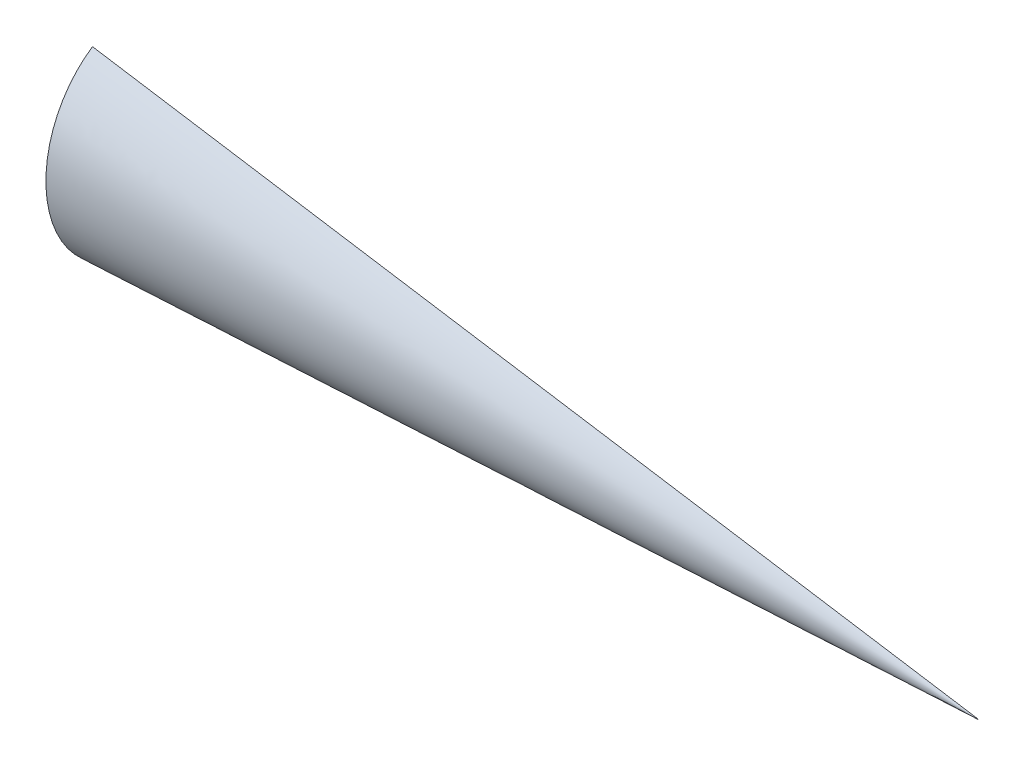
ISO-10303-21;
HEADER;
FILE_DESCRIPTION(('STEP AP214'),'2;1');
FILE_NAME('part.step','',(''),(''),'','','');
FILE_SCHEMA(('AUTOMOTIVE_DESIGN { 1 0 10303 214 1 1 1 1 }'));
ENDSEC;
DATA;
#1=APPLICATION_CONTEXT('core data for automotive mechanical design processes');
#2=APPLICATION_PROTOCOL_DEFINITION('international standard','automotive_design',2000,#1);
#3=PRODUCT_CONTEXT('',#1,'mechanical');
#4=PRODUCT('Part','Part','',(#3));
#5=PRODUCT_RELATED_PRODUCT_CATEGORY('part','',(#4));
#6=PRODUCT_DEFINITION_FORMATION('','',#4);
#7=PRODUCT_DEFINITION_CONTEXT('part definition',#1,'design');
#8=PRODUCT_DEFINITION('design','',#6,#7);
#9=PRODUCT_DEFINITION_SHAPE('','',#8);
#10=(LENGTH_UNIT() NAMED_UNIT(*) SI_UNIT(.MILLI.,.METRE.));
#11=(NAMED_UNIT(*) PLANE_ANGLE_UNIT() SI_UNIT($,.RADIAN.));
#12=(NAMED_UNIT(*) SI_UNIT($,.STERADIAN.) SOLID_ANGLE_UNIT());
#13=UNCERTAINTY_MEASURE_WITH_UNIT(LENGTH_MEASURE(1.E-05),#10,'distance_accuracy_value','');
#14=(GEOMETRIC_REPRESENTATION_CONTEXT(3) GLOBAL_UNCERTAINTY_ASSIGNED_CONTEXT((#13)) GLOBAL_UNIT_ASSIGNED_CONTEXT((#10,
#11,#12)) REPRESENTATION_CONTEXT('',''));
#15=CARTESIAN_POINT('',(0.,0.,0.));
#16=DIRECTION('',(0.,0.,1.));
#17=DIRECTION('',(1.,0.,0.));
#18=AXIS2_PLACEMENT_3D('',#15,#16,#17);
#19=CARTESIAN_POINT('',(0.,0.,0.));
#20=DIRECTION('',(1.,0.,0.));
#21=DIRECTION('',(0.,0.,-1.));
#22=AXIS2_PLACEMENT_3D('',#19,#20,#21);
#23=PLANE('',#22);
#24=CARTESIAN_POINT('',(0.,0.,0.));
#25=DIRECTION('',(1.,0.,0.));
#26=DIRECTION('',(0.,1.,0.));
#27=AXIS2_PLACEMENT_3D('',#24,#25,#26);
#28=ELLIPSE('',#27,0.2,0.1);
#29=CARTESIAN_POINT('',(0.,-0.199126845211858,-0.00933407086930567));
#30=VERTEX_POINT('',#29);
#31=CARTESIAN_POINT('',(0.,0.199126845211858,-0.00933407086930592));
#32=VERTEX_POINT('',#31);
#33=EDGE_CURVE('E11',#30,#32,#28,.T.);
#34=ORIENTED_EDGE('',*,*,#33,.T.);
#35=EDGE_CURVE('E52',#32,#30,#28,.T.);
#36=ORIENTED_EDGE('',*,*,#35,.T.);
#37=EDGE_LOOP('',(#34,#36));
#38=FACE_BOUND('',#37,.T.);
#39=ADVANCED_FACE('F45',(#38),#23,.T.);
#40=CARTESIAN_POINT('',(-1000.,0.,0.));
#41=DIRECTION('',(1.,0.,0.));
#42=DIRECTION('',(0.,0.,-1.));
#43=AXIS2_PLACEMENT_3D('',#40,#41,#42);
#44=PLANE('',#43);
#45=CARTESIAN_POINT('',(-1000.,0.,-99.9));
#46=DIRECTION('',(1.,0.,0.));
#47=DIRECTION('',(0.,-1.,0.));
#48=AXIS2_PLACEMENT_3D('',#45,#46,#47);
#49=ELLIPSE('',#48,134.164078649987,75.);
#50=CARTESIAN_POINT('',(-1000.,100.,-49.9000000000001));
#51=VERTEX_POINT('',#50);
#52=CARTESIAN_POINT('',(-1000.,-100.,-49.8999999999999));
#53=VERTEX_POINT('',#52);
#54=EDGE_CURVE('E73',#51,#53,#49,.T.);
#55=ORIENTED_EDGE('',*,*,#54,.T.);
#56=CARTESIAN_POINT('',(-1000.,0.,-99.9));
#57=DIRECTION('',(1.,0.,0.));
#58=DIRECTION('',(0.,-1.,0.));
#59=AXIS2_PLACEMENT_3D('',#56,#57,#58);
#60=ELLIPSE('',#59,115.470053837925,100.);
#61=EDGE_CURVE('E70',#51,#53,#60,.T.);
#62=ORIENTED_EDGE('',*,*,#61,.F.);
#63=EDGE_LOOP('',(#55,#62));
#64=FACE_BOUND('',#63,.T.);
#65=ADVANCED_FACE('F72',(#64),#44,.F.);
#66=CARTESIAN_POINT('',(-1000.,-99.9999999999999,-49.8999999999999));
#67=CARTESIAN_POINT('',(0.,-0.199126845211858,-0.00933407086930571));
#68=CARTESIAN_POINT('',(-1000.,-42.8571428571427,-14.1857142857143));
#69=CARTESIAN_POINT('',(0.,-0.16780143541008,-0.176402923145458));
#70=CARTESIAN_POINT('',(-1000.,42.857142857143,-14.1857142857143));
#71=CARTESIAN_POINT('',(0.,0.167801435410079,-0.176402923145458));
#72=CARTESIAN_POINT('',(-1000.,100.,-49.9));
#73=CARTESIAN_POINT('',(0.,0.199126845211858,-0.00933407086930592));
#74=(BOUNDED_SURFACE() B_SPLINE_SURFACE(3,1,((#66,#67),(#68,#69),(#70,#71),(#72,#73)),
.UNSPECIFIED.,.F.,.F.,.F.) B_SPLINE_SURFACE_WITH_KNOTS((4,4),(2,2),(0.,1.),(0.,1.),
.UNSPECIFIED.) GEOMETRIC_REPRESENTATION_ITEM() RATIONAL_B_SPLINE_SURFACE(((1.,1.),
(0.777777777777778,0.395560472462039),(0.777777777777778,0.395560472462039),(1.,1.))) REPRESENTATION_ITEM('') SURFACE());
#75=DIRECTION('',(0.993832876461276,-0.0991853888407701,0.0495829840289166));
#76=VECTOR('',#75,1.);
#77=CARTESIAN_POINT('',(-500.,50.099563422606,-24.9546670354347));
#78=LINE('',#77,#76);
#79=EDGE_CURVE('E79',#51,#32,#78,.T.);
#80=DIRECTION('',(-0.993832876461276,-0.0991853888407699,-0.0495829840289165));
#81=VECTOR('',#80,1.);
#82=CARTESIAN_POINT('',(-500.,-50.0995634226059,-24.9546670354346));
#83=LINE('',#82,#81);
#84=EDGE_CURVE('E63',#30,#53,#83,.T.);
#85=ORIENTED_EDGE('',*,*,#54,.F.);
#86=ORIENTED_EDGE('',*,*,#79,.T.);
#87=ORIENTED_EDGE('',*,*,#33,.F.);
#88=ORIENTED_EDGE('',*,*,#84,.T.);
#89=EDGE_LOOP('',(#85,#86,#87,#88));
#90=FACE_BOUND('',#89,.T.);
#91=ADVANCED_FACE('F78',(#90),#74,.T.);
#92=CARTESIAN_POINT('',(-1000.,100.,-49.9000000000001));
#93=CARTESIAN_POINT('',(0.,0.199126845211858,-0.00933407086930592));
#94=CARTESIAN_POINT('',(-1000.,80.0000000000001,-19.9000000000001));
#95=CARTESIAN_POINT('',(0.,0.210890862992002,0.0534073572914644));
#96=CARTESIAN_POINT('',(-1000.,44.4444444444446,0.0999999999999797));
#97=CARTESIAN_POINT('',(0.,0.126033088294082,0.1));
#98=CARTESIAN_POINT('',(-1000.,-44.4444444444444,0.10000000000004));
#99=CARTESIAN_POINT('',(0.,-0.126033088294082,0.1));
#100=CARTESIAN_POINT('',(-1000.,-80.,-19.9));
#101=CARTESIAN_POINT('',(0.,-0.210890862992002,0.0534073572914645));
#102=CARTESIAN_POINT('',(-1000.,-100.,-49.8999999999999));
#103=CARTESIAN_POINT('',(0.,-0.199126845211858,-0.0093340708693058));
#104=(BOUNDED_SURFACE() B_SPLINE_SURFACE(3,1,((#92,#93),(#94,#95),(#96,#97),(#98,#99),(#100,
#101),(#102,#103)),.UNSPECIFIED.,.F.,.F.,.F.) B_SPLINE_SURFACE_WITH_KNOTS((4,2,4),(2,2),(0.,0.5,
1.),(0.,1.),.UNSPECIFIED.) GEOMETRIC_REPRESENTATION_ITEM() RATIONAL_B_SPLINE_SURFACE(((1.,1.),
(0.833333333333333,0.611834327271855),(0.75,0.478575828067094),(0.75,0.478575828067094),
(0.833333333333333,0.611834327271855),(1.,1.))) REPRESENTATION_ITEM('') SURFACE());
#105=ORIENTED_EDGE('',*,*,#61,.T.);
#106=ORIENTED_EDGE('',*,*,#84,.F.);
#107=ORIENTED_EDGE('',*,*,#35,.F.);
#108=ORIENTED_EDGE('',*,*,#79,.F.);
#109=EDGE_LOOP('',(#105,#106,#107,#108));
#110=FACE_BOUND('',#109,.T.);
#111=ADVANCED_FACE('F81',(#110),#104,.T.);
#112=CLOSED_SHELL('',(#39,#65,#91,#111));
#113=MANIFOLD_SOLID_BREP('B2',#112);
#114=ADVANCED_BREP_SHAPE_REPRESENTATION('',(#18,#113),#14);
#115=SHAPE_DEFINITION_REPRESENTATION(#9,#114);
ENDSEC;
END-ISO-10303-21;
